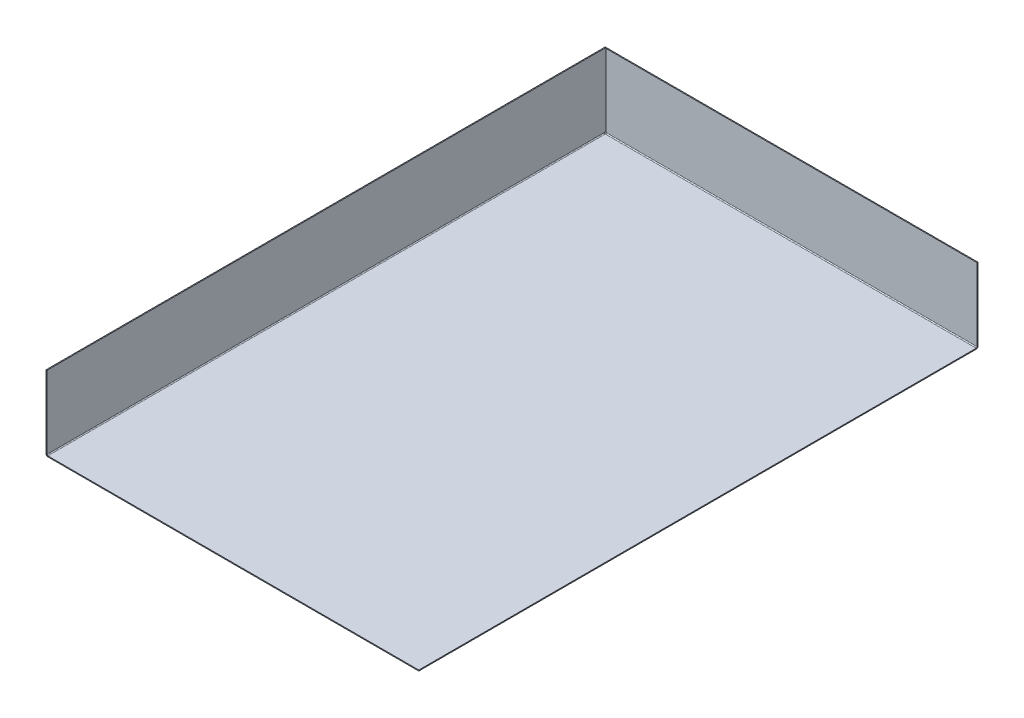
ISO-10303-21;
HEADER;
FILE_DESCRIPTION(('STEP AP214'),'2;1');
FILE_NAME('part.step','',(''),(''),'','','');
FILE_SCHEMA(('AUTOMOTIVE_DESIGN { 1 0 10303 214 1 1 1 1 }'));
ENDSEC;
DATA;
#1=APPLICATION_CONTEXT('core data for automotive mechanical design processes');
#2=APPLICATION_PROTOCOL_DEFINITION('international standard','automotive_design',2000,#1);
#3=PRODUCT_CONTEXT('',#1,'mechanical');
#4=PRODUCT('Part','Part','',(#3));
#5=PRODUCT_RELATED_PRODUCT_CATEGORY('part','',(#4));
#6=PRODUCT_DEFINITION_FORMATION('','',#4);
#7=PRODUCT_DEFINITION_CONTEXT('part definition',#1,'design');
#8=PRODUCT_DEFINITION('design','',#6,#7);
#9=PRODUCT_DEFINITION_SHAPE('','',#8);
#10=(LENGTH_UNIT() NAMED_UNIT(*) SI_UNIT(.MILLI.,.METRE.));
#11=(NAMED_UNIT(*) PLANE_ANGLE_UNIT() SI_UNIT($,.RADIAN.));
#12=(NAMED_UNIT(*) SI_UNIT($,.STERADIAN.) SOLID_ANGLE_UNIT());
#13=UNCERTAINTY_MEASURE_WITH_UNIT(LENGTH_MEASURE(1.E-05),#10,'distance_accuracy_value','');
#14=(GEOMETRIC_REPRESENTATION_CONTEXT(3) GLOBAL_UNCERTAINTY_ASSIGNED_CONTEXT((#13)) GLOBAL_UNIT_ASSIGNED_CONTEXT((#10,
#11,#12)) REPRESENTATION_CONTEXT('',''));
#15=CARTESIAN_POINT('',(0.,0.,0.));
#16=DIRECTION('',(0.,0.,1.));
#17=DIRECTION('',(1.,0.,0.));
#18=AXIS2_PLACEMENT_3D('',#15,#16,#17);
#19=CARTESIAN_POINT('',(-500.,0.,750.));
#20=DIRECTION('',(0.,1.,0.));
#21=DIRECTION('',(1.,0.,0.));
#22=AXIS2_PLACEMENT_3D('',#19,#20,#21);
#23=PLANE('',#22);
#24=DIRECTION('',(1.,0.,0.));
#25=VECTOR('',#24,1.);
#26=CARTESIAN_POINT('',(-747.5,0.,5.));
#27=LINE('',#26,#25);
#28=CARTESIAN_POINT('',(-995.,0.,5.));
#29=VERTEX_POINT('',#28);
#30=CARTESIAN_POINT('',(0.,0.,5.));
#31=VERTEX_POINT('',#30);
#32=EDGE_CURVE('E211',#29,#31,#27,.T.);
#33=ORIENTED_EDGE('',*,*,#32,.T.);
#34=DIRECTION('',(0.,0.,-1.));
#35=VECTOR('',#34,1.);
#36=CARTESIAN_POINT('',(0.,0.,1500.));
#37=LINE('',#36,#35);
#38=CARTESIAN_POINT('',(0.,0.,1500.));
#39=VERTEX_POINT('',#38);
#40=EDGE_CURVE('E170',#39,#31,#37,.T.);
#41=ORIENTED_EDGE('',*,*,#40,.F.);
#42=DIRECTION('',(1.,0.,0.));
#43=VECTOR('',#42,1.);
#44=CARTESIAN_POINT('',(-1000.,0.,1500.));
#45=LINE('',#44,#43);
#46=CARTESIAN_POINT('',(-995.,0.,1500.));
#47=VERTEX_POINT('',#46);
#48=EDGE_CURVE('E11',#47,#39,#45,.T.);
#49=ORIENTED_EDGE('',*,*,#48,.F.);
#50=DIRECTION('',(0.,0.,-1.));
#51=VECTOR('',#50,1.);
#52=CARTESIAN_POINT('',(-995.,0.,1125.));
#53=LINE('',#52,#51);
#54=EDGE_CURVE('E264',#47,#29,#53,.T.);
#55=ORIENTED_EDGE('',*,*,#54,.T.);
#56=EDGE_LOOP('',(#33,#41,#49,#55));
#57=FACE_BOUND('',#56,.T.);
#58=ADVANCED_FACE('F17',(#57),#23,.F.);
#59=CARTESIAN_POINT('',(0.,0.,1500.));
#60=DIRECTION('',(0.,0.,1.));
#61=DIRECTION('',(1.,0.,0.));
#62=AXIS2_PLACEMENT_3D('',#59,#60,#61);
#63=PLANE('',#62);
#64=DIRECTION('',(0.,-1.,0.));
#65=VECTOR('',#64,1.);
#66=CARTESIAN_POINT('',(-995.,1.25,1500.));
#67=LINE('',#66,#65);
#68=CARTESIAN_POINT('',(-995.,2.5,1500.));
#69=VERTEX_POINT('',#68);
#70=EDGE_CURVE('E219',#69,#47,#67,.T.);
#71=ORIENTED_EDGE('',*,*,#70,.T.);
#72=ORIENTED_EDGE('',*,*,#48,.T.);
#73=DIRECTION('',(0.,1.,0.));
#74=VECTOR('',#73,1.);
#75=CARTESIAN_POINT('',(0.,0.,1500.));
#76=LINE('',#75,#74);
#77=CARTESIAN_POINT('',(0.,2.5,1500.));
#78=VERTEX_POINT('',#77);
#79=EDGE_CURVE('E151',#39,#78,#76,.T.);
#80=ORIENTED_EDGE('',*,*,#79,.T.);
#81=DIRECTION('',(-1.,0.,0.));
#82=VECTOR('',#81,1.);
#83=CARTESIAN_POINT('',(-1000.,2.5,1500.));
#84=LINE('',#83,#82);
#85=EDGE_CURVE('E145',#78,#69,#84,.T.);
#86=ORIENTED_EDGE('',*,*,#85,.T.);
#87=EDGE_LOOP('',(#71,#72,#80,#86));
#88=FACE_BOUND('',#87,.T.);
#89=ADVANCED_FACE('F521',(#88),#63,.T.);
#90=CARTESIAN_POINT('',(-995.,5.,750.));
#91=DIRECTION('',(0.,0.,-1.));
#92=DIRECTION('',(0.,-1.,0.));
#93=AXIS2_PLACEMENT_3D('',#90,#91,#92);
#94=CYLINDRICAL_SURFACE('',#93,2.50000000000019);
#95=CARTESIAN_POINT('',(-995.,5.,5.));
#96=DIRECTION('',(0.,0.,-1.));
#97=DIRECTION('',(0.,-1.,0.));
#98=AXIS2_PLACEMENT_3D('',#95,#96,#97);
#99=CIRCLE('',#98,2.50000000000019);
#100=CARTESIAN_POINT('',(-995.,2.5,5.));
#101=VERTEX_POINT('',#100);
#102=CARTESIAN_POINT('',(-997.5,5.,5.));
#103=VERTEX_POINT('',#102);
#104=EDGE_CURVE('E265',#101,#103,#99,.T.);
#105=ORIENTED_EDGE('',*,*,#104,.T.);
#106=DIRECTION('',(0.,0.,-1.));
#107=VECTOR('',#106,1.);
#108=CARTESIAN_POINT('',(-997.5,5.,750.));
#109=LINE('',#108,#107);
#110=CARTESIAN_POINT('',(-997.5,5.00000000000014,1500.));
#111=VERTEX_POINT('',#110);
#112=EDGE_CURVE('E228',#111,#103,#109,.T.);
#113=ORIENTED_EDGE('',*,*,#112,.F.);
#114=CARTESIAN_POINT('',(-995.,5.,1500.));
#115=DIRECTION('',(0.,0.,1.));
#116=DIRECTION('',(-1.,0.,0.));
#117=AXIS2_PLACEMENT_3D('',#114,#115,#116);
#118=CIRCLE('',#117,2.5);
#119=EDGE_CURVE('E223',#111,#69,#118,.T.);
#120=ORIENTED_EDGE('',*,*,#119,.T.);
#121=DIRECTION('',(0.,0.,1.));
#122=VECTOR('',#121,1.);
#123=CARTESIAN_POINT('',(-995.,2.5,1125.));
#124=LINE('',#123,#122);
#125=EDGE_CURVE('E205',#101,#69,#124,.T.);
#126=ORIENTED_EDGE('',*,*,#125,.F.);
#127=EDGE_LOOP('',(#105,#113,#120,#126));
#128=FACE_BOUND('',#127,.T.);
#129=ADVANCED_FACE('F500',(#128),#94,.F.);
#130=CARTESIAN_POINT('',(-1000.,99.6725666117692,750.));
#131=DIRECTION('',(1.,0.,0.));
#132=DIRECTION('',(0.,1.,0.));
#133=AXIS2_PLACEMENT_3D('',#130,#131,#132);
#134=PLANE('',#133);
#135=DIRECTION('',(0.,0.,1.));
#136=VECTOR('',#135,1.);
#137=CARTESIAN_POINT('',(-1000.,5.,750.));
#138=LINE('',#137,#136);
#139=CARTESIAN_POINT('',(-1000.,5.,0.));
#140=VERTEX_POINT('',#139);
#141=CARTESIAN_POINT('',(-1000.,5.,5.));
#142=VERTEX_POINT('',#141);
#143=EDGE_CURVE('E196',#140,#142,#138,.T.);
#144=ORIENTED_EDGE('',*,*,#143,.T.);
#145=DIRECTION('',(0.,0.,1.));
#146=VECTOR('',#145,1.);
#147=CARTESIAN_POINT('',(-1000.,5.,750.));
#148=LINE('',#147,#146);
#149=CARTESIAN_POINT('',(-1000.,5.00000000000014,1500.));
#150=VERTEX_POINT('',#149);
#151=EDGE_CURVE('E152',#142,#150,#148,.T.);
#152=ORIENTED_EDGE('',*,*,#151,.T.);
#153=DIRECTION('',(0.,-1.,0.));
#154=VECTOR('',#153,1.);
#155=CARTESIAN_POINT('',(-1000.,-6.30973355292312,1500.));
#156=LINE('',#155,#154);
#157=CARTESIAN_POINT('',(-1000.,200.,1500.));
#158=VERTEX_POINT('',#157);
#159=EDGE_CURVE('E284',#158,#150,#156,.T.);
#160=ORIENTED_EDGE('',*,*,#159,.F.);
#161=DIRECTION('',(0.,0.,1.));
#162=VECTOR('',#161,1.);
#163=CARTESIAN_POINT('',(-1000.,200.,0.));
#164=LINE('',#163,#162);
#165=CARTESIAN_POINT('',(-1000.,200.,0.));
#166=VERTEX_POINT('',#165);
#167=EDGE_CURVE('E28',#166,#158,#164,.T.);
#168=ORIENTED_EDGE('',*,*,#167,.F.);
#169=DIRECTION('',(0.,1.,0.));
#170=VECTOR('',#169,1.);
#171=CARTESIAN_POINT('',(-1000.,5.,0.));
#172=LINE('',#171,#170);
#173=EDGE_CURVE('E251',#140,#166,#172,.T.);
#174=ORIENTED_EDGE('',*,*,#173,.F.);
#175=EDGE_LOOP('',(#144,#152,#160,#168,#174));
#176=FACE_BOUND('',#175,.T.);
#177=ADVANCED_FACE('F495',(#176),#134,.F.);
#178=CARTESIAN_POINT('',(-997.5,200.,0.));
#179=DIRECTION('',(0.,1.,0.));
#180=DIRECTION('',(1.,0.,0.));
#181=AXIS2_PLACEMENT_3D('',#178,#179,#180);
#182=PLANE('',#181);
#183=ORIENTED_EDGE('',*,*,#167,.T.);
#184=DIRECTION('',(-1.,0.,0.));
#185=VECTOR('',#184,1.);
#186=CARTESIAN_POINT('',(-997.5,200.,1500.));
#187=LINE('',#186,#185);
#188=CARTESIAN_POINT('',(-997.5,200.,1500.));
#189=VERTEX_POINT('',#188);
#190=EDGE_CURVE('E280',#189,#158,#187,.T.);
#191=ORIENTED_EDGE('',*,*,#190,.F.);
#192=DIRECTION('',(0.,0.,1.));
#193=VECTOR('',#192,1.);
#194=CARTESIAN_POINT('',(-997.5,200.,0.));
#195=LINE('',#194,#193);
#196=CARTESIAN_POINT('',(-997.5,200.,0.));
#197=VERTEX_POINT('',#196);
#198=EDGE_CURVE('E224',#197,#189,#195,.T.);
#199=ORIENTED_EDGE('',*,*,#198,.F.);
#200=DIRECTION('',(-1.,0.,0.));
#201=VECTOR('',#200,1.);
#202=CARTESIAN_POINT('',(-997.5,200.,0.));
#203=LINE('',#202,#201);
#204=EDGE_CURVE('E351',#197,#166,#203,.T.);
#205=ORIENTED_EDGE('',*,*,#204,.T.);
#206=EDGE_LOOP('',(#183,#191,#199,#205));
#207=FACE_BOUND('',#206,.T.);
#208=ADVANCED_FACE('F306',(#207),#182,.T.);
#209=CARTESIAN_POINT('',(-997.5,5.00000000000014,0.));
#210=DIRECTION('',(0.,0.,-1.));
#211=DIRECTION('',(-1.,0.,0.));
#212=AXIS2_PLACEMENT_3D('',#209,#210,#211);
#213=PLANE('',#212);
#214=DIRECTION('',(-1.,0.,0.));
#215=VECTOR('',#214,1.);
#216=CARTESIAN_POINT('',(-998.05,5.,0.));
#217=LINE('',#216,#215);
#218=CARTESIAN_POINT('',(-997.5,5.,0.));
#219=VERTEX_POINT('',#218);
#220=EDGE_CURVE('E163',#219,#140,#217,.T.);
#221=ORIENTED_EDGE('',*,*,#220,.T.);
#222=ORIENTED_EDGE('',*,*,#173,.T.);
#223=ORIENTED_EDGE('',*,*,#204,.F.);
#224=DIRECTION('',(0.,-1.,0.));
#225=VECTOR('',#224,1.);
#226=CARTESIAN_POINT('',(-997.5,-6.30973355292312,0.));
#227=LINE('',#226,#225);
#228=EDGE_CURVE('E225',#197,#219,#227,.T.);
#229=ORIENTED_EDGE('',*,*,#228,.T.);
#230=EDGE_LOOP('',(#221,#222,#223,#229));
#231=FACE_BOUND('',#230,.T.);
#232=ADVANCED_FACE('F511',(#231),#213,.T.);
#233=CARTESIAN_POINT('',(-1000.,5.00000000000026,1500.));
#234=DIRECTION('',(0.,0.,1.));
#235=DIRECTION('',(1.,0.,0.));
#236=AXIS2_PLACEMENT_3D('',#233,#234,#235);
#237=PLANE('',#236);
#238=DIRECTION('',(1.,0.,0.));
#239=VECTOR('',#238,1.);
#240=CARTESIAN_POINT('',(-998.05,5.00000000000014,1500.));
#241=LINE('',#240,#239);
#242=EDGE_CURVE('E198',#150,#111,#241,.T.);
#243=ORIENTED_EDGE('',*,*,#242,.F.);
#244=CARTESIAN_POINT('',(-995.,5.,1500.));
#245=DIRECTION('',(0.,0.,1.));
#246=DIRECTION('',(-1.,0.,0.));
#247=AXIS2_PLACEMENT_3D('',#244,#245,#246);
#248=CIRCLE('',#247,5.);
#249=EDGE_CURVE('E268',#150,#47,#248,.T.);
#250=ORIENTED_EDGE('',*,*,#249,.T.);
#251=ORIENTED_EDGE('',*,*,#70,.F.);
#252=ORIENTED_EDGE('',*,*,#119,.F.);
#253=EDGE_LOOP('',(#243,#250,#251,#252));
#254=FACE_BOUND('',#253,.T.);
#255=ADVANCED_FACE('F506',(#254),#237,.T.);
#256=CARTESIAN_POINT('',(-997.5,99.6725666117692,750.));
#257=DIRECTION('',(1.,0.,0.));
#258=DIRECTION('',(0.,1.,0.));
#259=AXIS2_PLACEMENT_3D('',#256,#257,#258);
#260=PLANE('',#259);
#261=ORIENTED_EDGE('',*,*,#112,.T.);
#262=DIRECTION('',(0.,0.,-1.));
#263=VECTOR('',#262,1.);
#264=CARTESIAN_POINT('',(-997.5,5.,750.));
#265=LINE('',#264,#263);
#266=EDGE_CURVE('E197',#103,#219,#265,.T.);
#267=ORIENTED_EDGE('',*,*,#266,.T.);
#268=ORIENTED_EDGE('',*,*,#228,.F.);
#269=ORIENTED_EDGE('',*,*,#198,.T.);
#270=DIRECTION('',(0.,-1.,0.));
#271=VECTOR('',#270,1.);
#272=CARTESIAN_POINT('',(-997.5,-6.30973355292312,1500.));
#273=LINE('',#272,#271);
#274=EDGE_CURVE('E202',#189,#111,#273,.T.);
#275=ORIENTED_EDGE('',*,*,#274,.T.);
#276=EDGE_LOOP('',(#261,#267,#268,#269,#275));
#277=FACE_BOUND('',#276,.T.);
#278=ADVANCED_FACE('F303',(#277),#260,.T.);
#279=CARTESIAN_POINT('',(-997.5,5.00000000000014,1500.));
#280=DIRECTION('',(0.,0.,1.));
#281=DIRECTION('',(1.,0.,0.));
#282=AXIS2_PLACEMENT_3D('',#279,#280,#281);
#283=PLANE('',#282);
#284=ORIENTED_EDGE('',*,*,#242,.T.);
#285=ORIENTED_EDGE('',*,*,#274,.F.);
#286=ORIENTED_EDGE('',*,*,#190,.T.);
#287=ORIENTED_EDGE('',*,*,#159,.T.);
#288=EDGE_LOOP('',(#284,#285,#286,#287));
#289=FACE_BOUND('',#288,.T.);
#290=ADVANCED_FACE('F308',(#289),#283,.T.);
#291=CARTESIAN_POINT('',(-500.,2.5,750.));
#292=DIRECTION('',(0.,1.,0.));
#293=DIRECTION('',(1.,0.,0.));
#294=AXIS2_PLACEMENT_3D('',#291,#292,#293);
#295=PLANE('',#294);
#296=DIRECTION('',(-1.,0.,0.));
#297=VECTOR('',#296,1.);
#298=CARTESIAN_POINT('',(-747.5,2.5,5.));
#299=LINE('',#298,#297);
#300=CARTESIAN_POINT('',(0.,2.5,5.));
#301=VERTEX_POINT('',#300);
#302=EDGE_CURVE('E142',#301,#101,#299,.T.);
#303=ORIENTED_EDGE('',*,*,#302,.T.);
#304=ORIENTED_EDGE('',*,*,#125,.T.);
#305=ORIENTED_EDGE('',*,*,#85,.F.);
#306=DIRECTION('',(0.,0.,1.));
#307=VECTOR('',#306,1.);
#308=CARTESIAN_POINT('',(0.,2.5,1500.));
#309=LINE('',#308,#307);
#310=EDGE_CURVE('E138',#301,#78,#309,.T.);
#311=ORIENTED_EDGE('',*,*,#310,.F.);
#312=EDGE_LOOP('',(#303,#304,#305,#311));
#313=FACE_BOUND('',#312,.T.);
#314=ADVANCED_FACE('F140',(#313),#295,.T.);
#315=CARTESIAN_POINT('',(0.,0.,0.));
#316=DIRECTION('',(1.,0.,0.));
#317=DIRECTION('',(0.,1.,0.));
#318=AXIS2_PLACEMENT_3D('',#315,#316,#317);
#319=PLANE('',#318);
#320=DIRECTION('',(0.,1.,0.));
#321=VECTOR('',#320,1.);
#322=CARTESIAN_POINT('',(0.,1.25,5.));
#323=LINE('',#322,#321);
#324=EDGE_CURVE('E167',#31,#301,#323,.T.);
#325=ORIENTED_EDGE('',*,*,#324,.T.);
#326=ORIENTED_EDGE('',*,*,#310,.T.);
#327=ORIENTED_EDGE('',*,*,#79,.F.);
#328=ORIENTED_EDGE('',*,*,#40,.T.);
#329=EDGE_LOOP('',(#325,#326,#327,#328));
#330=FACE_BOUND('',#329,.T.);
#331=ADVANCED_FACE('F168',(#330),#319,.T.);
#332=CARTESIAN_POINT('',(-995.,5.,750.));
#333=DIRECTION('',(0.,0.,-1.));
#334=DIRECTION('',(0.,-1.,0.));
#335=AXIS2_PLACEMENT_3D('',#332,#333,#334);
#336=CYLINDRICAL_SURFACE('',#335,5.00000000000019);
#337=CARTESIAN_POINT('',(-995.,5.,5.));
#338=DIRECTION('',(0.,0.,1.));
#339=DIRECTION('',(0.,-1.,0.));
#340=AXIS2_PLACEMENT_3D('',#337,#338,#339);
#341=CIRCLE('',#340,5.00000000000019);
#342=EDGE_CURVE('E260',#142,#29,#341,.T.);
#343=ORIENTED_EDGE('',*,*,#342,.T.);
#344=ORIENTED_EDGE('',*,*,#54,.F.);
#345=ORIENTED_EDGE('',*,*,#249,.F.);
#346=ORIENTED_EDGE('',*,*,#151,.F.);
#347=EDGE_LOOP('',(#343,#344,#345,#346));
#348=FACE_BOUND('',#347,.T.);
#349=ADVANCED_FACE('F335',(#348),#336,.T.);
#350=CARTESIAN_POINT('',(-997.381083570727,2.6189164292728,5.));
#351=DIRECTION('',(0.,0.,1.));
#352=DIRECTION('',(1.,0.,0.));
#353=AXIS2_PLACEMENT_3D('',#350,#351,#352);
#354=PLANE('',#353);
#355=ORIENTED_EDGE('',*,*,#104,.F.);
#356=DIRECTION('',(0.,-1.,0.));
#357=VECTOR('',#356,1.);
#358=CARTESIAN_POINT('',(-995.,2.5,5.));
#359=LINE('',#358,#357);
#360=EDGE_CURVE('E175',#101,#29,#359,.T.);
#361=ORIENTED_EDGE('',*,*,#360,.T.);
#362=ORIENTED_EDGE('',*,*,#342,.F.);
#363=DIRECTION('',(-1.,0.,0.));
#364=VECTOR('',#363,1.);
#365=CARTESIAN_POINT('',(-997.5,5.,5.));
#366=LINE('',#365,#364);
#367=EDGE_CURVE('E192',#103,#142,#366,.T.);
#368=ORIENTED_EDGE('',*,*,#367,.F.);
#369=EDGE_LOOP('',(#355,#361,#362,#368));
#370=FACE_BOUND('',#369,.T.);
#371=ADVANCED_FACE('F339',(#370),#354,.F.);
#372=CARTESIAN_POINT('',(-997.5,5.,5.));
#373=DIRECTION('',(0.,1.,0.));
#374=DIRECTION('',(1.,0.,0.));
#375=AXIS2_PLACEMENT_3D('',#372,#373,#374);
#376=PLANE('',#375);
#377=ORIENTED_EDGE('',*,*,#220,.F.);
#378=ORIENTED_EDGE('',*,*,#266,.F.);
#379=ORIENTED_EDGE('',*,*,#367,.T.);
#380=ORIENTED_EDGE('',*,*,#143,.F.);
#381=EDGE_LOOP('',(#377,#378,#379,#380));
#382=FACE_BOUND('',#381,.T.);
#383=ADVANCED_FACE('F600',(#382),#376,.F.);
#384=CARTESIAN_POINT('',(-497.5,5.,5.));
#385=DIRECTION('',(1.,0.,0.));
#386=DIRECTION('',(0.,-1.,0.));
#387=AXIS2_PLACEMENT_3D('',#384,#385,#386);
#388=CYLINDRICAL_SURFACE('',#387,2.5);
#389=DIRECTION('',(1.,0.,0.));
#390=VECTOR('',#389,1.);
#391=CARTESIAN_POINT('',(-497.5,5.,2.5));
#392=LINE('',#391,#390);
#393=CARTESIAN_POINT('',(-995.,5.,2.5));
#394=VERTEX_POINT('',#393);
#395=CARTESIAN_POINT('',(0.,5.,2.5));
#396=VERTEX_POINT('',#395);
#397=EDGE_CURVE('E208',#394,#396,#392,.T.);
#398=ORIENTED_EDGE('',*,*,#397,.F.);
#399=CARTESIAN_POINT('',(-995.,5.,5.));
#400=DIRECTION('',(-1.,0.,0.));
#401=DIRECTION('',(0.,0.,-1.));
#402=AXIS2_PLACEMENT_3D('',#399,#400,#401);
#403=CIRCLE('',#402,2.5);
#404=EDGE_CURVE('E160',#394,#101,#403,.T.);
#405=ORIENTED_EDGE('',*,*,#404,.T.);
#406=ORIENTED_EDGE('',*,*,#302,.F.);
#407=CARTESIAN_POINT('',(0.,5.,5.));
#408=DIRECTION('',(-1.,0.,0.));
#409=DIRECTION('',(0.,0.,-1.));
#410=AXIS2_PLACEMENT_3D('',#407,#408,#409);
#411=CIRCLE('',#410,2.5);
#412=EDGE_CURVE('E158',#396,#301,#411,.T.);
#413=ORIENTED_EDGE('',*,*,#412,.F.);
#414=EDGE_LOOP('',(#398,#405,#406,#413));
#415=FACE_BOUND('',#414,.T.);
#416=ADVANCED_FACE('F156',(#415),#388,.F.);
#417=CARTESIAN_POINT('',(-497.5,99.6725666117692,0.));
#418=DIRECTION('',(0.,0.,1.));
#419=DIRECTION('',(0.,-1.,0.));
#420=AXIS2_PLACEMENT_3D('',#417,#418,#419);
#421=PLANE('',#420);
#422=DIRECTION('',(-1.,0.,0.));
#423=VECTOR('',#422,1.);
#424=CARTESIAN_POINT('',(-497.5,5.,0.));
#425=LINE('',#424,#423);
#426=CARTESIAN_POINT('',(0.,5.,0.));
#427=VERTEX_POINT('',#426);
#428=CARTESIAN_POINT('',(-995.,5.,0.));
#429=VERTEX_POINT('',#428);
#430=EDGE_CURVE('E21',#427,#429,#425,.T.);
#431=ORIENTED_EDGE('',*,*,#430,.T.);
#432=DIRECTION('',(0.,-1.,0.));
#433=VECTOR('',#432,1.);
#434=CARTESIAN_POINT('',(-995.,-6.30973355292326,0.));
#435=LINE('',#434,#433);
#436=CARTESIAN_POINT('',(-995.,200.,0.));
#437=VERTEX_POINT('',#436);
#438=EDGE_CURVE('E206',#437,#429,#435,.T.);
#439=ORIENTED_EDGE('',*,*,#438,.F.);
#440=DIRECTION('',(-1.,0.,0.));
#441=VECTOR('',#440,1.);
#442=CARTESIAN_POINT('',(0.,200.,0.));
#443=LINE('',#442,#441);
#444=CARTESIAN_POINT('',(0.,200.,0.));
#445=VERTEX_POINT('',#444);
#446=EDGE_CURVE('E164',#445,#437,#443,.T.);
#447=ORIENTED_EDGE('',*,*,#446,.F.);
#448=DIRECTION('',(0.,1.,0.));
#449=VECTOR('',#448,1.);
#450=CARTESIAN_POINT('',(0.,5.,0.));
#451=LINE('',#450,#449);
#452=EDGE_CURVE('E229',#427,#445,#451,.T.);
#453=ORIENTED_EDGE('',*,*,#452,.F.);
#454=EDGE_LOOP('',(#431,#439,#447,#453));
#455=FACE_BOUND('',#454,.T.);
#456=ADVANCED_FACE('F19',(#455),#421,.F.);
#457=CARTESIAN_POINT('',(0.,200.,2.5));
#458=DIRECTION('',(0.,1.,0.));
#459=DIRECTION('',(0.,0.,-1.));
#460=AXIS2_PLACEMENT_3D('',#457,#458,#459);
#461=PLANE('',#460);
#462=ORIENTED_EDGE('',*,*,#446,.T.);
#463=DIRECTION('',(0.,0.,-1.));
#464=VECTOR('',#463,1.);
#465=CARTESIAN_POINT('',(-995.,200.,2.5));
#466=LINE('',#465,#464);
#467=CARTESIAN_POINT('',(-995.,200.,2.5));
#468=VERTEX_POINT('',#467);
#469=EDGE_CURVE('E209',#468,#437,#466,.T.);
#470=ORIENTED_EDGE('',*,*,#469,.F.);
#471=DIRECTION('',(-1.,0.,0.));
#472=VECTOR('',#471,1.);
#473=CARTESIAN_POINT('',(0.,200.,2.5));
#474=LINE('',#473,#472);
#475=CARTESIAN_POINT('',(0.,200.,2.5));
#476=VERTEX_POINT('',#475);
#477=EDGE_CURVE('E187',#476,#468,#474,.T.);
#478=ORIENTED_EDGE('',*,*,#477,.F.);
#479=DIRECTION('',(0.,0.,-1.));
#480=VECTOR('',#479,1.);
#481=CARTESIAN_POINT('',(0.,200.,2.5));
#482=LINE('',#481,#480);
#483=EDGE_CURVE('E189',#476,#445,#482,.T.);
#484=ORIENTED_EDGE('',*,*,#483,.T.);
#485=EDGE_LOOP('',(#462,#470,#478,#484));
#486=FACE_BOUND('',#485,.T.);
#487=ADVANCED_FACE('F488',(#486),#461,.T.);
#488=CARTESIAN_POINT('',(0.,5.,2.5));
#489=DIRECTION('',(1.,0.,0.));
#490=DIRECTION('',(0.,0.,-1.));
#491=AXIS2_PLACEMENT_3D('',#488,#489,#490);
#492=PLANE('',#491);
#493=DIRECTION('',(0.,0.,-1.));
#494=VECTOR('',#493,1.);
#495=CARTESIAN_POINT('',(0.,5.,1.95));
#496=LINE('',#495,#494);
#497=EDGE_CURVE('E179',#396,#427,#496,.T.);
#498=ORIENTED_EDGE('',*,*,#497,.T.);
#499=ORIENTED_EDGE('',*,*,#452,.T.);
#500=ORIENTED_EDGE('',*,*,#483,.F.);
#501=DIRECTION('',(0.,-1.,0.));
#502=VECTOR('',#501,1.);
#503=CARTESIAN_POINT('',(0.,-6.30973355292326,2.5));
#504=LINE('',#503,#502);
#505=EDGE_CURVE('E216',#476,#396,#504,.T.);
#506=ORIENTED_EDGE('',*,*,#505,.T.);
#507=EDGE_LOOP('',(#498,#499,#500,#506));
#508=FACE_BOUND('',#507,.T.);
#509=ADVANCED_FACE('F483',(#508),#492,.T.);
#510=CARTESIAN_POINT('',(-995.,5.,0.));
#511=DIRECTION('',(-1.,0.,0.));
#512=DIRECTION('',(0.,1.,0.));
#513=AXIS2_PLACEMENT_3D('',#510,#511,#512);
#514=PLANE('',#513);
#515=DIRECTION('',(0.,0.,1.));
#516=VECTOR('',#515,1.);
#517=CARTESIAN_POINT('',(-995.,5.,1.95));
#518=LINE('',#517,#516);
#519=EDGE_CURVE('E242',#429,#394,#518,.T.);
#520=ORIENTED_EDGE('',*,*,#519,.F.);
#521=CARTESIAN_POINT('',(-995.,5.,5.));
#522=DIRECTION('',(-1.,0.,0.));
#523=DIRECTION('',(0.,0.,-1.));
#524=AXIS2_PLACEMENT_3D('',#521,#522,#523);
#525=CIRCLE('',#524,5.);
#526=EDGE_CURVE('E214',#429,#29,#525,.T.);
#527=ORIENTED_EDGE('',*,*,#526,.T.);
#528=ORIENTED_EDGE('',*,*,#360,.F.);
#529=ORIENTED_EDGE('',*,*,#404,.F.);
#530=EDGE_LOOP('',(#520,#527,#528,#529));
#531=FACE_BOUND('',#530,.T.);
#532=ADVANCED_FACE('F324',(#531),#514,.T.);
#533=CARTESIAN_POINT('',(0.,5.,2.5));
#534=DIRECTION('',(1.,0.,0.));
#535=DIRECTION('',(0.,0.,-1.));
#536=AXIS2_PLACEMENT_3D('',#533,#534,#535);
#537=PLANE('',#536);
#538=ORIENTED_EDGE('',*,*,#497,.F.);
#539=ORIENTED_EDGE('',*,*,#412,.T.);
#540=ORIENTED_EDGE('',*,*,#324,.F.);
#541=CARTESIAN_POINT('',(0.,5.,5.));
#542=DIRECTION('',(1.,0.,0.));
#543=DIRECTION('',(0.,-1.,0.));
#544=AXIS2_PLACEMENT_3D('',#541,#542,#543);
#545=CIRCLE('',#544,5.);
#546=EDGE_CURVE('E215',#31,#427,#545,.T.);
#547=ORIENTED_EDGE('',*,*,#546,.T.);
#548=EDGE_LOOP('',(#538,#539,#540,#547));
#549=FACE_BOUND('',#548,.T.);
#550=ADVANCED_FACE('F177',(#549),#537,.T.);
#551=CARTESIAN_POINT('',(-497.5,99.6725666117692,2.5));
#552=DIRECTION('',(0.,0.,1.));
#553=DIRECTION('',(0.,-1.,0.));
#554=AXIS2_PLACEMENT_3D('',#551,#552,#553);
#555=PLANE('',#554);
#556=ORIENTED_EDGE('',*,*,#397,.T.);
#557=ORIENTED_EDGE('',*,*,#505,.F.);
#558=ORIENTED_EDGE('',*,*,#477,.T.);
#559=DIRECTION('',(0.,-1.,0.));
#560=VECTOR('',#559,1.);
#561=CARTESIAN_POINT('',(-995.,-6.30973355292326,2.5));
#562=LINE('',#561,#560);
#563=EDGE_CURVE('E236',#468,#394,#562,.T.);
#564=ORIENTED_EDGE('',*,*,#563,.T.);
#565=EDGE_LOOP('',(#556,#557,#558,#564));
#566=FACE_BOUND('',#565,.T.);
#567=ADVANCED_FACE('F557',(#566),#555,.T.);
#568=CARTESIAN_POINT('',(-995.,5.,2.5));
#569=DIRECTION('',(-1.,0.,0.));
#570=DIRECTION('',(0.,1.,0.));
#571=AXIS2_PLACEMENT_3D('',#568,#569,#570);
#572=PLANE('',#571);
#573=ORIENTED_EDGE('',*,*,#519,.T.);
#574=ORIENTED_EDGE('',*,*,#563,.F.);
#575=ORIENTED_EDGE('',*,*,#469,.T.);
#576=ORIENTED_EDGE('',*,*,#438,.T.);
#577=EDGE_LOOP('',(#573,#574,#575,#576));
#578=FACE_BOUND('',#577,.T.);
#579=ADVANCED_FACE('F545',(#578),#572,.T.);
#580=CARTESIAN_POINT('',(-497.5,5.,5.));
#581=DIRECTION('',(1.,0.,0.));
#582=DIRECTION('',(0.,-1.,0.));
#583=AXIS2_PLACEMENT_3D('',#580,#581,#582);
#584=CYLINDRICAL_SURFACE('',#583,5.);
#585=ORIENTED_EDGE('',*,*,#430,.F.);
#586=ORIENTED_EDGE('',*,*,#546,.F.);
#587=ORIENTED_EDGE('',*,*,#32,.F.);
#588=ORIENTED_EDGE('',*,*,#526,.F.);
#589=EDGE_LOOP('',(#585,#586,#587,#588));
#590=FACE_BOUND('',#589,.T.);
#591=ADVANCED_FACE('F329',(#590),#584,.T.);
#592=CLOSED_SHELL('',(#58,#89,#129,#177,#208,#232,#255,#278,#290,#314,#331,#349,#371,#383,#416,
#456,#487,#509,#532,#550,#567,#579,#591));
#593=MANIFOLD_SOLID_BREP('B1',#592);
#594=ADVANCED_BREP_SHAPE_REPRESENTATION('',(#18,#593),#14);
#595=SHAPE_DEFINITION_REPRESENTATION(#9,#594);
ENDSEC;
END-ISO-10303-21;
